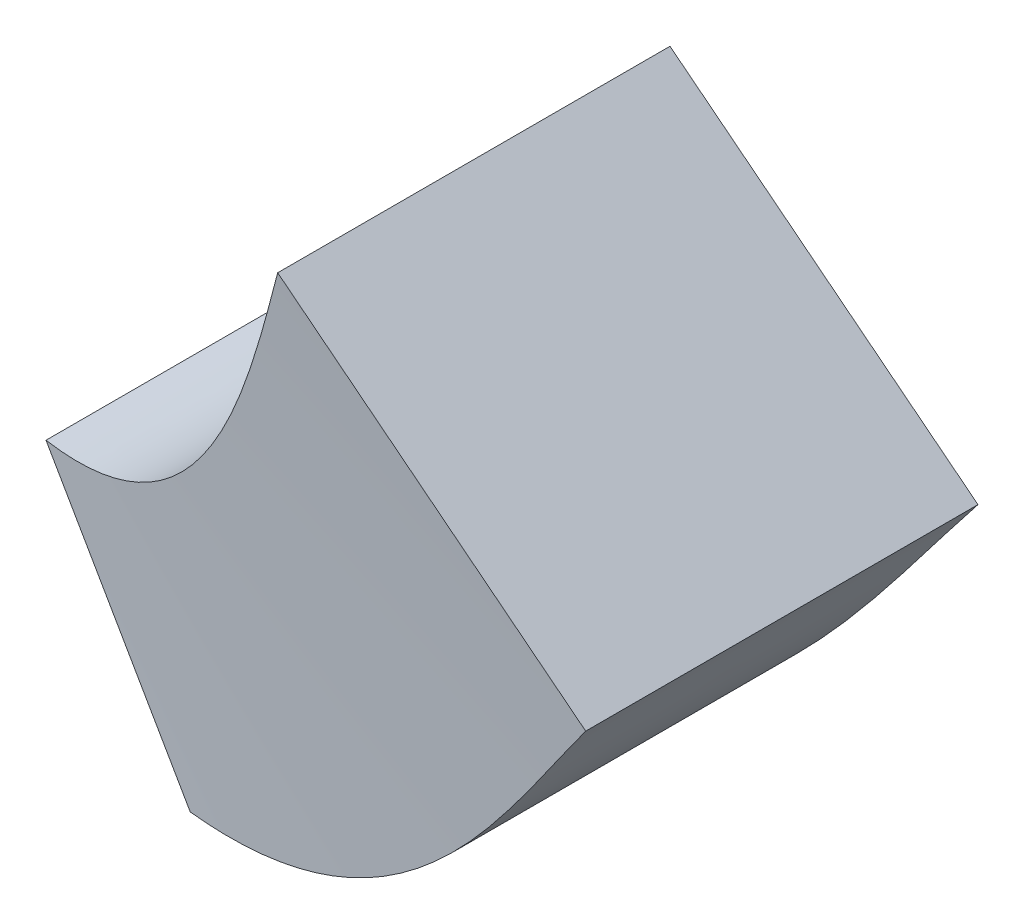
ISO-10303-21;
HEADER;
FILE_DESCRIPTION(('STEP AP214'),'2;1');
FILE_NAME('part.step','',(''),(''),'','','');
FILE_SCHEMA(('AUTOMOTIVE_DESIGN { 1 0 10303 214 1 1 1 1 }'));
ENDSEC;
DATA;
#1=APPLICATION_CONTEXT('core data for automotive mechanical design processes');
#2=APPLICATION_PROTOCOL_DEFINITION('international standard','automotive_design',2000,#1);
#3=PRODUCT_CONTEXT('',#1,'mechanical');
#4=PRODUCT('Part','Part','',(#3));
#5=PRODUCT_RELATED_PRODUCT_CATEGORY('part','',(#4));
#6=PRODUCT_DEFINITION_FORMATION('','',#4);
#7=PRODUCT_DEFINITION_CONTEXT('part definition',#1,'design');
#8=PRODUCT_DEFINITION('design','',#6,#7);
#9=PRODUCT_DEFINITION_SHAPE('','',#8);
#10=(LENGTH_UNIT() NAMED_UNIT(*) SI_UNIT(.MILLI.,.METRE.));
#11=(NAMED_UNIT(*) PLANE_ANGLE_UNIT() SI_UNIT($,.RADIAN.));
#12=(NAMED_UNIT(*) SI_UNIT($,.STERADIAN.) SOLID_ANGLE_UNIT());
#13=UNCERTAINTY_MEASURE_WITH_UNIT(LENGTH_MEASURE(1.E-05),#10,'distance_accuracy_value','');
#14=(GEOMETRIC_REPRESENTATION_CONTEXT(3) GLOBAL_UNCERTAINTY_ASSIGNED_CONTEXT((#13)) GLOBAL_UNIT_ASSIGNED_CONTEXT((#10,
#11,#12)) REPRESENTATION_CONTEXT('',''));
#15=CARTESIAN_POINT('',(0.,0.,0.));
#16=DIRECTION('',(0.,0.,1.));
#17=DIRECTION('',(1.,0.,0.));
#18=AXIS2_PLACEMENT_3D('',#15,#16,#17);
#19=CARTESIAN_POINT('',(58.8897274573417,34.,0.));
#20=DIRECTION('',(-0.866025403784438,-0.5,0.));
#21=DIRECTION('',(0.5,-0.866025403784438,0.));
#22=AXIS2_PLACEMENT_3D('',#19,#20,#21);
#23=PLANE('',#22);
#24=DIRECTION('',(0.,0.,1.));
#25=VECTOR('',#24,1.);
#26=CARTESIAN_POINT('',(65.1397274573417,23.1746824526945,12.5));
#27=LINE('',#26,#25);
#28=CARTESIAN_POINT('',(65.1397274573417,23.1746824526945,-12.5));
#29=VERTEX_POINT('',#28);
#30=CARTESIAN_POINT('',(65.1397274573417,23.1746824526945,12.5));
#31=VERTEX_POINT('',#30);
#32=EDGE_CURVE('E253',#29,#31,#27,.T.);
#33=ORIENTED_EDGE('',*,*,#32,.T.);
#34=DIRECTION('',(-0.5,0.866025403784438,0.));
#35=VECTOR('',#34,1.);
#36=CARTESIAN_POINT('',(52.6397274573417,44.8253175473054,12.5));
#37=LINE('',#36,#35);
#38=CARTESIAN_POINT('',(52.6397274573417,44.8253175473054,12.5));
#39=VERTEX_POINT('',#38);
#40=EDGE_CURVE('E13',#31,#39,#37,.T.);
#41=ORIENTED_EDGE('',*,*,#40,.T.);
#42=DIRECTION('',(0.,0.,-1.));
#43=VECTOR('',#42,1.);
#44=CARTESIAN_POINT('',(52.6397274573417,44.8253175473054,12.5));
#45=LINE('',#44,#43);
#46=CARTESIAN_POINT('',(52.6397274573417,44.8253175473054,-12.5));
#47=VERTEX_POINT('',#46);
#48=EDGE_CURVE('E138',#39,#47,#45,.T.);
#49=ORIENTED_EDGE('',*,*,#48,.T.);
#50=DIRECTION('',(0.5,-0.866025403784438,0.));
#51=VECTOR('',#50,1.);
#52=CARTESIAN_POINT('',(52.6397274573417,44.8253175473054,-12.5));
#53=LINE('',#52,#51);
#54=EDGE_CURVE('E273',#47,#29,#53,.T.);
#55=ORIENTED_EDGE('',*,*,#54,.T.);
#56=EDGE_LOOP('',(#33,#41,#49,#55));
#57=FACE_BOUND('',#56,.T.);
#58=ADVANCED_FACE('F127',(#57),#23,.T.);
#59=CARTESIAN_POINT('',(64.5995241667015,81.8926472793842,0.));
#60=DIRECTION('',(-0.619333778257937,-0.785127805588841,0.));
#61=DIRECTION('',(0.785127805588841,-0.619333778257937,0.));
#62=AXIS2_PLACEMENT_3D('',#59,#60,#61);
#63=PLANE('',#62);
#64=DIRECTION('',(0.,0.,1.));
#65=VECTOR('',#64,1.);
#66=CARTESIAN_POINT('',(103.915143769596,50.8792363927954,17.));
#67=LINE('',#66,#65);
#68=CARTESIAN_POINT('',(103.915143769596,50.8792363927954,-17.));
#69=VERTEX_POINT('',#68);
#70=CARTESIAN_POINT('',(103.915143769596,50.8792363927954,17.));
#71=VERTEX_POINT('',#70);
#72=EDGE_CURVE('E241',#69,#71,#67,.T.);
#73=ORIENTED_EDGE('',*,*,#72,.F.);
#74=DIRECTION('',(0.785127805588841,-0.619333778257937,0.));
#75=VECTOR('',#74,1.);
#76=CARTESIAN_POINT('',(77.2207983795755,71.9365848535653,-17.));
#77=LINE('',#76,#75);
#78=CARTESIAN_POINT('',(77.2207983795755,71.9365848535653,-17.));
#79=VERTEX_POINT('',#78);
#80=EDGE_CURVE('E197',#79,#69,#77,.T.);
#81=ORIENTED_EDGE('',*,*,#80,.F.);
#82=DIRECTION('',(0.,0.,-1.));
#83=VECTOR('',#82,1.);
#84=CARTESIAN_POINT('',(77.2207983795755,71.9365848535653,17.));
#85=LINE('',#84,#83);
#86=CARTESIAN_POINT('',(77.2207983795755,71.9365848535653,17.));
#87=VERTEX_POINT('',#86);
#88=EDGE_CURVE('E177',#87,#79,#85,.T.);
#89=ORIENTED_EDGE('',*,*,#88,.F.);
#90=DIRECTION('',(-0.785127805588841,0.619333778257937,0.));
#91=VECTOR('',#90,1.);
#92=CARTESIAN_POINT('',(77.2207983795755,71.9365848535653,17.));
#93=LINE('',#92,#91);
#94=EDGE_CURVE('E184',#71,#87,#93,.T.);
#95=ORIENTED_EDGE('',*,*,#94,.F.);
#96=EDGE_LOOP('',(#73,#81,#89,#95));
#97=FACE_BOUND('',#96,.T.);
#98=ADVANCED_FACE('F196',(#97),#63,.F.);
#99=CARTESIAN_POINT('',(103.915143769596,50.8792363927954,-17.));
#100=CARTESIAN_POINT('',(95.1365671181537,39.514644238975,-15.5));
#101=CARTESIAN_POINT('',(85.3929113927303,22.5362956487617,-14.));
#102=CARTESIAN_POINT('',(65.1397274573417,23.1746824526945,-12.5));
#103=CARTESIAN_POINT('',(103.915143769596,50.8792363927954,-15.5833333333333));
#104=CARTESIAN_POINT('',(95.1365671181537,39.514644238975,-14.2083333333333));
#105=CARTESIAN_POINT('',(85.3929113927303,22.5362956487617,-12.8333333333333));
#106=CARTESIAN_POINT('',(65.1397274573417,23.1746824526945,-11.4583333333333));
#107=CARTESIAN_POINT('',(103.915143769596,50.8792363927955,-12.75));
#108=CARTESIAN_POINT('',(95.1365671181538,39.5146442389751,-11.625));
#109=CARTESIAN_POINT('',(85.3929113927303,22.5362956487618,-10.5));
#110=CARTESIAN_POINT('',(65.1397274573418,23.1746824526945,-9.37500000000001));
#111=CARTESIAN_POINT('',(103.915143769596,50.8792363927953,-8.5));
#112=CARTESIAN_POINT('',(95.1365671181537,39.5146442389749,-7.75));
#113=CARTESIAN_POINT('',(85.3929113927302,22.5362956487617,-6.99999999999999));
#114=CARTESIAN_POINT('',(65.1397274573416,23.1746824526944,-6.24999999999999));
#115=CARTESIAN_POINT('',(103.915143769596,50.8792363927955,-4.25));
#116=CARTESIAN_POINT('',(95.1365671181537,39.5146442389751,-3.875));
#117=CARTESIAN_POINT('',(85.3929113927303,22.5362956487618,-3.5));
#118=CARTESIAN_POINT('',(65.1397274573418,23.1746824526945,-3.12500000000001));
#119=CARTESIAN_POINT('',(103.915143769596,50.8792363927954,-1.41666666666667));
#120=CARTESIAN_POINT('',(95.1365671181537,39.514644238975,-1.29166666666667));
#121=CARTESIAN_POINT('',(85.3929113927303,22.5362956487617,-1.16666666666667));
#122=CARTESIAN_POINT('',(65.1397274573417,23.1746824526945,-1.04166666666667));
#123=CARTESIAN_POINT('',(103.915143769596,50.8792363927954,1.41666666666667));
#124=CARTESIAN_POINT('',(95.1365671181537,39.514644238975,1.29166666666667));
#125=CARTESIAN_POINT('',(85.3929113927303,22.5362956487617,1.16666666666667));
#126=CARTESIAN_POINT('',(65.1397274573417,23.1746824526945,1.04166666666667));
#127=CARTESIAN_POINT('',(103.915143769596,50.8792363927955,4.25000000000001));
#128=CARTESIAN_POINT('',(95.1365671181538,39.5146442389751,3.87500000000001));
#129=CARTESIAN_POINT('',(85.3929113927303,22.5362956487618,3.50000000000001));
#130=CARTESIAN_POINT('',(65.1397274573417,23.1746824526945,3.12500000000001));
#131=CARTESIAN_POINT('',(103.915143769596,50.8792363927952,8.49999999999999));
#132=CARTESIAN_POINT('',(95.1365671181537,39.5146442389749,7.74999999999999));
#133=CARTESIAN_POINT('',(85.3929113927302,22.5362956487617,6.99999999999998));
#134=CARTESIAN_POINT('',(65.1397274573417,23.1746824526944,6.24999999999998));
#135=CARTESIAN_POINT('',(103.915143769596,50.8792363927955,12.75));
#136=CARTESIAN_POINT('',(95.1365671181537,39.5146442389751,11.625));
#137=CARTESIAN_POINT('',(85.3929113927303,22.5362956487618,10.5));
#138=CARTESIAN_POINT('',(65.1397274573418,23.1746824526945,9.37500000000002));
#139=CARTESIAN_POINT('',(103.915143769596,50.8792363927954,15.5833333333333));
#140=CARTESIAN_POINT('',(95.1365671181537,39.514644238975,14.2083333333333));
#141=CARTESIAN_POINT('',(85.3929113927303,22.5362956487617,12.8333333333333));
#142=CARTESIAN_POINT('',(65.1397274573417,23.1746824526945,11.4583333333333));
#143=CARTESIAN_POINT('',(103.915143769596,50.8792363927954,17.));
#144=CARTESIAN_POINT('',(95.1365671181537,39.514644238975,15.5));
#145=CARTESIAN_POINT('',(85.3929113927303,22.5362956487617,14.));
#146=CARTESIAN_POINT('',(65.1397274573417,23.1746824526945,12.5));
#147=B_SPLINE_SURFACE_WITH_KNOTS('',3,3,((#99,#100,#101,#102),(#103,#104,#105,#106),(#107,#108,
#109,#110),(#111,#112,#113,#114),(#115,#116,#117,#118),(#119,#120,#121,#122),(#123,#124,#125,
#126),(#127,#128,#129,#130),(#131,#132,#133,#134),(#135,#136,#137,#138),(#139,#140,#141,#142),
(#143,#144,#145,#146)),.UNSPECIFIED.,.F.,.F.,.F.,(4,1,1,1,2,1,1,1,4),(4,4),(0.75,0.78125,0.8125,
0.84375,0.875,0.90625,0.9375,0.96875,1.),(0.,1.),.UNSPECIFIED.);
#148=CARTESIAN_POINT('',(103.915143769596,50.8792363927954,17.));
#149=CARTESIAN_POINT('',(95.1365671181537,39.514644238975,15.5));
#150=CARTESIAN_POINT('',(85.3929113927303,22.5362956487617,14.));
#151=CARTESIAN_POINT('',(65.1397274573417,23.1746824526945,12.5));
#152=B_SPLINE_CURVE_WITH_KNOTS('',3,(#148,#149,#150,#151),.UNSPECIFIED.,.F.,.F.,(4,4),(0.,1.),.UNSPECIFIED.);
#153=EDGE_CURVE('E146',#71,#31,#152,.T.);
#154=CARTESIAN_POINT('',(103.915143769596,50.8792363927954,-17.));
#155=CARTESIAN_POINT('',(95.1365671181537,39.514644238975,-15.5));
#156=CARTESIAN_POINT('',(85.3929113927303,22.5362956487617,-14.));
#157=CARTESIAN_POINT('',(65.1397274573417,23.1746824526945,-12.5));
#158=B_SPLINE_CURVE_WITH_KNOTS('',3,(#154,#155,#156,#157),.UNSPECIFIED.,.F.,.F.,(4,4),(0.,1.),.UNSPECIFIED.);
#159=EDGE_CURVE('E283',#69,#29,#158,.T.);
#160=ORIENTED_EDGE('',*,*,#72,.T.);
#161=ORIENTED_EDGE('',*,*,#153,.T.);
#162=ORIENTED_EDGE('',*,*,#32,.F.);
#163=ORIENTED_EDGE('',*,*,#159,.F.);
#164=EDGE_LOOP('',(#160,#161,#162,#163));
#165=FACE_BOUND('',#164,.T.);
#166=ADVANCED_FACE('F217',(#165),#147,.T.);
#167=CARTESIAN_POINT('',(77.2207983795755,71.9365848535653,-17.));
#168=CARTESIAN_POINT('',(73.1736701914733,60.7697549110252,-15.5));
#169=CARTESIAN_POINT('',(68.1614629293901,43.9891685320923,-14.));
#170=CARTESIAN_POINT('',(52.6397274573417,44.8253175473054,-12.5));
#171=CARTESIAN_POINT('',(79.4453271620772,70.1818058151678,-17.));
#172=CARTESIAN_POINT('',(75.00391160203,58.9984956883544,-15.5));
#173=CARTESIAN_POINT('',(69.5974169680017,42.2014291251481,-14.));
#174=CARTESIAN_POINT('',(53.6813941240083,43.0210979560879,-12.5));
#175=CARTESIAN_POINT('',(83.8943847270807,66.6722477383729,-17.));
#176=CARTESIAN_POINT('',(78.6643944231434,55.4559772430128,-15.5));
#177=CARTESIAN_POINT('',(72.4693250452251,38.6259503112597,-14.));
#178=CARTESIAN_POINT('',(55.7647274573417,39.4126587736527,-12.5));
#179=CARTESIAN_POINT('',(90.5679710745858,61.4079106231802,-17.));
#180=CARTESIAN_POINT('',(84.1551186548135,50.142199575,-15.5));
#181=CARTESIAN_POINT('',(76.7771871610602,33.262732090427,-14.));
#182=CARTESIAN_POINT('',(58.8897274573417,33.9999999999999,-12.5));
#183=CARTESIAN_POINT('',(97.241557422091,56.1435735079879,-17.));
#184=CARTESIAN_POINT('',(89.6458428864837,44.8284219069876,-15.5));
#185=CARTESIAN_POINT('',(81.0850492768952,27.8995138695944,-14.));
#186=CARTESIAN_POINT('',(62.0147274573417,28.5873412263472,-12.5));
#187=CARTESIAN_POINT('',(101.690614987094,52.6340154311929,-17.));
#188=CARTESIAN_POINT('',(93.306325707597,41.2859034616458,-15.5));
#189=CARTESIAN_POINT('',(83.9569573541186,24.324035055706,-14.));
#190=CARTESIAN_POINT('',(64.098060790675,24.9789020439121,-12.5));
#191=CARTESIAN_POINT('',(103.915143769596,50.8792363927954,-17.));
#192=CARTESIAN_POINT('',(95.1365671181537,39.514644238975,-15.5));
#193=CARTESIAN_POINT('',(85.3929113927303,22.5362956487617,-14.));
#194=CARTESIAN_POINT('',(65.1397274573417,23.1746824526945,-12.5));
#195=B_SPLINE_SURFACE_WITH_KNOTS('',3,3,((#167,#168,#169,#170),(#171,#172,#173,#174),(#175,#176,
#177,#178),(#179,#180,#181,#182),(#183,#184,#185,#186),(#187,#188,#189,#190),(#191,#192,#193,
#194)),.UNSPECIFIED.,.F.,.F.,.F.,(4,1,1,1,4),(4,4),(0.5,0.5625,0.625,0.6875,0.75),(0.,1.),.UNSPECIFIED.);
#196=CARTESIAN_POINT('',(77.2207983795755,71.9365848535653,-17.));
#197=CARTESIAN_POINT('',(73.1736701914733,60.7697549110252,-15.5));
#198=CARTESIAN_POINT('',(68.1614629293901,43.9891685320923,-14.));
#199=CARTESIAN_POINT('',(52.6397274573417,44.8253175473054,-12.5));
#200=B_SPLINE_CURVE_WITH_KNOTS('',3,(#196,#197,#198,#199),.UNSPECIFIED.,.F.,.F.,(4,4),(0.,1.),.UNSPECIFIED.);
#201=EDGE_CURVE('E183',#79,#47,#200,.T.);
#202=ORIENTED_EDGE('',*,*,#80,.T.);
#203=ORIENTED_EDGE('',*,*,#159,.T.);
#204=ORIENTED_EDGE('',*,*,#54,.F.);
#205=ORIENTED_EDGE('',*,*,#201,.F.);
#206=EDGE_LOOP('',(#202,#203,#204,#205));
#207=FACE_BOUND('',#206,.T.);
#208=ADVANCED_FACE('F318',(#207),#195,.T.);
#209=CARTESIAN_POINT('',(77.2207983795755,71.9365848535653,17.));
#210=CARTESIAN_POINT('',(73.1736701914733,60.7697549110252,15.5));
#211=CARTESIAN_POINT('',(68.1614629293901,43.9891685320923,14.));
#212=CARTESIAN_POINT('',(52.6397274573417,44.8253175473054,12.5));
#213=CARTESIAN_POINT('',(77.2207983795755,71.9365848535653,14.1666666666667));
#214=CARTESIAN_POINT('',(73.1736701914733,60.7697549110252,12.9166666666667));
#215=CARTESIAN_POINT('',(68.1614629293901,43.9891685320923,11.6666666666667));
#216=CARTESIAN_POINT('',(52.6397274573417,44.8253175473055,10.4166666666667));
#217=CARTESIAN_POINT('',(77.2207983795755,71.9365848535653,8.5));
#218=CARTESIAN_POINT('',(73.1736701914734,60.7697549110253,7.75));
#219=CARTESIAN_POINT('',(68.1614629293901,43.9891685320924,7.00000000000001));
#220=CARTESIAN_POINT('',(52.6397274573418,44.8253175473055,6.25000000000001));
#221=CARTESIAN_POINT('',(77.2207983795755,71.9365848535653,0.));
#222=CARTESIAN_POINT('',(73.1736701914733,60.7697549110252,0.));
#223=CARTESIAN_POINT('',(68.16146292939,43.9891685320923,0.));
#224=CARTESIAN_POINT('',(52.6397274573416,44.8253175473054,0.));
#225=CARTESIAN_POINT('',(77.2207983795755,71.9365848535653,-8.5));
#226=CARTESIAN_POINT('',(73.1736701914734,60.7697549110252,-7.75));
#227=CARTESIAN_POINT('',(68.1614629293901,43.9891685320924,-7.));
#228=CARTESIAN_POINT('',(52.6397274573418,44.8253175473055,-6.25));
#229=CARTESIAN_POINT('',(77.2207983795755,71.9365848535653,-14.1666666666667));
#230=CARTESIAN_POINT('',(73.1736701914733,60.7697549110252,-12.9166666666667));
#231=CARTESIAN_POINT('',(68.1614629293901,43.9891685320923,-11.6666666666667));
#232=CARTESIAN_POINT('',(52.6397274573417,44.8253175473054,-10.4166666666667));
#233=CARTESIAN_POINT('',(77.2207983795755,71.9365848535653,-17.));
#234=CARTESIAN_POINT('',(73.1736701914733,60.7697549110252,-15.5));
#235=CARTESIAN_POINT('',(68.1614629293901,43.9891685320923,-14.));
#236=CARTESIAN_POINT('',(52.6397274573417,44.8253175473054,-12.5));
#237=B_SPLINE_SURFACE_WITH_KNOTS('',3,3,((#209,#210,#211,#212),(#213,#214,#215,#216),(#217,#218,
#219,#220),(#221,#222,#223,#224),(#225,#226,#227,#228),(#229,#230,#231,#232),(#233,#234,#235,
#236)),.UNSPECIFIED.,.F.,.F.,.F.,(4,1,1,1,4),(4,4),(0.25,0.3125,0.375,0.4375,0.5),(0.,1.),.UNSPECIFIED.);
#238=CARTESIAN_POINT('',(77.2207983795755,71.9365848535653,17.));
#239=CARTESIAN_POINT('',(73.1736701914733,60.7697549110252,15.5));
#240=CARTESIAN_POINT('',(68.1614629293901,43.9891685320923,14.));
#241=CARTESIAN_POINT('',(52.6397274573417,44.8253175473054,12.5));
#242=B_SPLINE_CURVE_WITH_KNOTS('',3,(#238,#239,#240,#241),.UNSPECIFIED.,.F.,.F.,(4,4),(0.,1.),.UNSPECIFIED.);
#243=EDGE_CURVE('E172',#87,#39,#242,.T.);
#244=ORIENTED_EDGE('',*,*,#88,.T.);
#245=ORIENTED_EDGE('',*,*,#201,.T.);
#246=ORIENTED_EDGE('',*,*,#48,.F.);
#247=ORIENTED_EDGE('',*,*,#243,.F.);
#248=EDGE_LOOP('',(#244,#245,#246,#247));
#249=FACE_BOUND('',#248,.T.);
#250=ADVANCED_FACE('F174',(#249),#237,.T.);
#251=CARTESIAN_POINT('',(103.915143769596,50.8792363927954,17.));
#252=CARTESIAN_POINT('',(95.1365671181537,39.514644238975,15.5));
#253=CARTESIAN_POINT('',(85.3929113927303,22.5362956487617,14.));
#254=CARTESIAN_POINT('',(65.1397274573417,23.1746824526945,12.5));
#255=CARTESIAN_POINT('',(101.690614987094,52.6340154311929,17.));
#256=CARTESIAN_POINT('',(93.306325707597,41.2859034616458,15.5));
#257=CARTESIAN_POINT('',(83.9569573541186,24.324035055706,14.));
#258=CARTESIAN_POINT('',(64.098060790675,24.9789020439121,12.5));
#259=CARTESIAN_POINT('',(97.241557422091,56.1435735079878,17.));
#260=CARTESIAN_POINT('',(89.6458428864836,44.8284219069875,15.5));
#261=CARTESIAN_POINT('',(81.0850492768952,27.8995138695944,14.));
#262=CARTESIAN_POINT('',(62.0147274573417,28.5873412263472,12.5));
#263=CARTESIAN_POINT('',(90.5679710745858,61.4079106231803,17.));
#264=CARTESIAN_POINT('',(84.1551186548135,50.1421995750001,15.5));
#265=CARTESIAN_POINT('',(76.7771871610602,33.262732090427,14.));
#266=CARTESIAN_POINT('',(58.8897274573418,34.,12.5));
#267=CARTESIAN_POINT('',(83.8943847270807,66.6722477383728,17.));
#268=CARTESIAN_POINT('',(78.6643944231434,55.4559772430127,15.5));
#269=CARTESIAN_POINT('',(72.4693250452251,38.6259503112597,14.));
#270=CARTESIAN_POINT('',(55.7647274573416,39.4126587736527,12.5));
#271=CARTESIAN_POINT('',(79.4453271620772,70.1818058151678,17.));
#272=CARTESIAN_POINT('',(75.00391160203,58.9984956883544,15.5));
#273=CARTESIAN_POINT('',(69.5974169680017,42.2014291251481,14.));
#274=CARTESIAN_POINT('',(53.6813941240084,43.0210979560879,12.5));
#275=CARTESIAN_POINT('',(77.2207983795755,71.9365848535653,17.));
#276=CARTESIAN_POINT('',(73.1736701914733,60.7697549110252,15.5));
#277=CARTESIAN_POINT('',(68.1614629293901,43.9891685320923,14.));
#278=CARTESIAN_POINT('',(52.6397274573417,44.8253175473054,12.5));
#279=B_SPLINE_SURFACE_WITH_KNOTS('',3,3,((#251,#252,#253,#254),(#255,#256,#257,#258),(#259,#260,
#261,#262),(#263,#264,#265,#266),(#267,#268,#269,#270),(#271,#272,#273,#274),(#275,#276,#277,
#278)),.UNSPECIFIED.,.F.,.F.,.F.,(4,1,1,1,4),(4,4),(0.,0.0625,0.125,0.1875,0.25),(0.,1.),.UNSPECIFIED.);
#280=ORIENTED_EDGE('',*,*,#94,.T.);
#281=ORIENTED_EDGE('',*,*,#243,.T.);
#282=ORIENTED_EDGE('',*,*,#40,.F.);
#283=ORIENTED_EDGE('',*,*,#153,.F.);
#284=EDGE_LOOP('',(#280,#281,#282,#283));
#285=FACE_BOUND('',#284,.T.);
#286=ADVANCED_FACE('F187',(#285),#279,.T.);
#287=CLOSED_SHELL('',(#58,#98,#166,#208,#250,#286));
#288=MANIFOLD_SOLID_BREP('B2',#287);
#289=ADVANCED_BREP_SHAPE_REPRESENTATION('',(#18,#288),#14);
#290=SHAPE_DEFINITION_REPRESENTATION(#9,#289);
ENDSEC;
END-ISO-10303-21;
